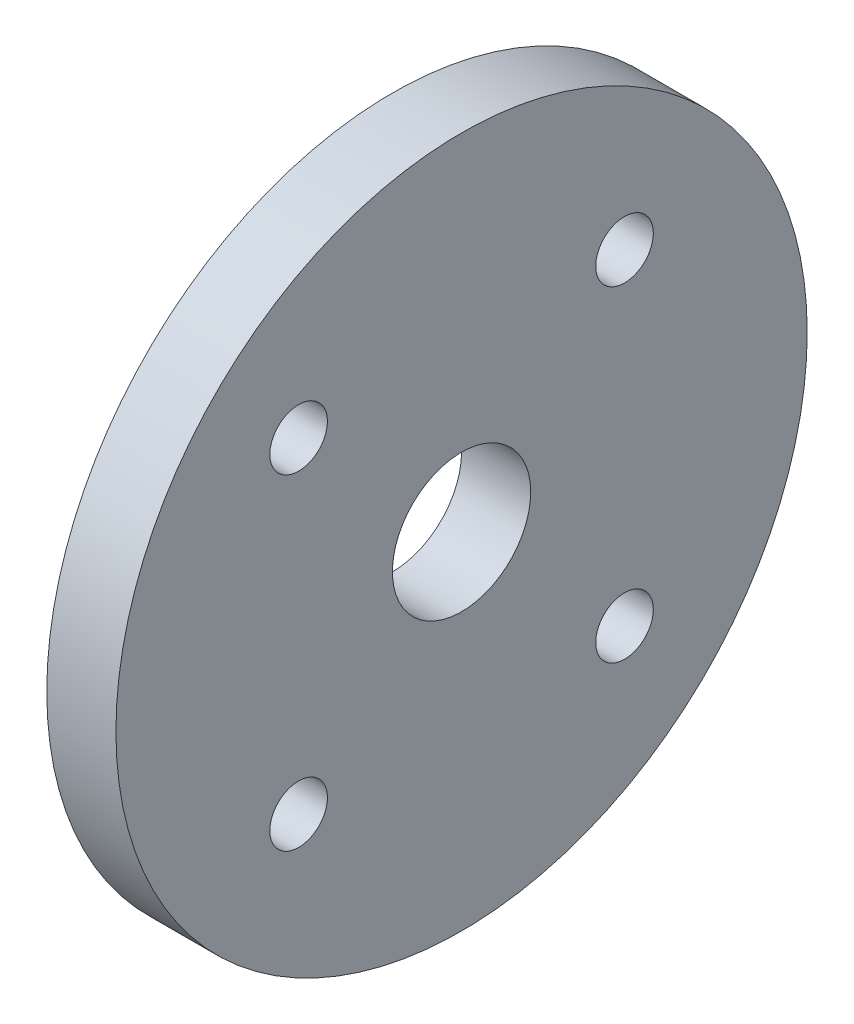
ISO-10303-21;
HEADER;
FILE_DESCRIPTION(('STEP AP214'),'2;1');
FILE_NAME('part.step','',(''),(''),'','','');
FILE_SCHEMA(('AUTOMOTIVE_DESIGN { 1 0 10303 214 1 1 1 1 }'));
ENDSEC;
DATA;
#1=APPLICATION_CONTEXT('core data for automotive mechanical design processes');
#2=APPLICATION_PROTOCOL_DEFINITION('international standard','automotive_design',2000,#1);
#3=PRODUCT_CONTEXT('',#1,'mechanical');
#4=PRODUCT('Part','Part','',(#3));
#5=PRODUCT_RELATED_PRODUCT_CATEGORY('part','',(#4));
#6=PRODUCT_DEFINITION_FORMATION('','',#4);
#7=PRODUCT_DEFINITION_CONTEXT('part definition',#1,'design');
#8=PRODUCT_DEFINITION('design','',#6,#7);
#9=PRODUCT_DEFINITION_SHAPE('','',#8);
#10=(LENGTH_UNIT() NAMED_UNIT(*) SI_UNIT(.MILLI.,.METRE.));
#11=(NAMED_UNIT(*) PLANE_ANGLE_UNIT() SI_UNIT($,.RADIAN.));
#12=(NAMED_UNIT(*) SI_UNIT($,.STERADIAN.) SOLID_ANGLE_UNIT());
#13=UNCERTAINTY_MEASURE_WITH_UNIT(LENGTH_MEASURE(1.E-05),#10,'distance_accuracy_value','');
#14=(GEOMETRIC_REPRESENTATION_CONTEXT(3) GLOBAL_UNCERTAINTY_ASSIGNED_CONTEXT((#13)) GLOBAL_UNIT_ASSIGNED_CONTEXT((#10,
#11,#12)) REPRESENTATION_CONTEXT('',''));
#15=CARTESIAN_POINT('',(0.,0.,0.));
#16=DIRECTION('',(0.,0.,1.));
#17=DIRECTION('',(1.,0.,0.));
#18=AXIS2_PLACEMENT_3D('',#15,#16,#17);
#19=CARTESIAN_POINT('',(3.,0.,0.));
#20=DIRECTION('',(-1.,0.,0.));
#21=DIRECTION('',(0.,0.,1.));
#22=AXIS2_PLACEMENT_3D('',#19,#20,#21);
#23=CYLINDRICAL_SURFACE('',#22,15.);
#24=CARTESIAN_POINT('',(3.,0.,0.));
#25=DIRECTION('',(1.,0.,0.));
#26=DIRECTION('',(0.,0.,-1.));
#27=AXIS2_PLACEMENT_3D('',#24,#25,#26);
#28=CIRCLE('',#27,15.);
#29=CARTESIAN_POINT('',(3.,0.,-15.));
#30=VERTEX_POINT('',#29);
#31=EDGE_CURVE('E10',#30,#30,#28,.T.);
#32=ORIENTED_EDGE('',*,*,#31,.F.);
#33=EDGE_LOOP('',(#32));
#34=FACE_BOUND('',#33,.T.);
#35=CARTESIAN_POINT('',(0.,0.,0.));
#36=DIRECTION('',(1.,0.,0.));
#37=DIRECTION('',(0.,0.,-1.));
#38=AXIS2_PLACEMENT_3D('',#35,#36,#37);
#39=CIRCLE('',#38,15.);
#40=CARTESIAN_POINT('',(0.,0.,-15.));
#41=VERTEX_POINT('',#40);
#42=EDGE_CURVE('E34',#41,#41,#39,.T.);
#43=ORIENTED_EDGE('',*,*,#42,.T.);
#44=EDGE_LOOP('',(#43));
#45=FACE_BOUND('',#44,.T.);
#46=ADVANCED_FACE('F31',(#34,#45),#23,.T.);
#47=CARTESIAN_POINT('',(3.,0.,0.));
#48=DIRECTION('',(1.,0.,0.));
#49=DIRECTION('',(0.,0.,-1.));
#50=AXIS2_PLACEMENT_3D('',#47,#48,#49);
#51=PLANE('',#50);
#52=CARTESIAN_POINT('',(3.,0.,0.));
#53=DIRECTION('',(1.,0.,0.));
#54=DIRECTION('',(0.,0.,-1.));
#55=AXIS2_PLACEMENT_3D('',#52,#53,#54);
#56=CIRCLE('',#55,3.);
#57=CARTESIAN_POINT('',(3.,0.,-3.));
#58=VERTEX_POINT('',#57);
#59=EDGE_CURVE('E67',#58,#58,#56,.T.);
#60=ORIENTED_EDGE('',*,*,#59,.F.);
#61=EDGE_LOOP('',(#60));
#62=FACE_BOUND('',#61,.T.);
#63=CARTESIAN_POINT('',(3.,7.07106781186547,7.07106781186548));
#64=DIRECTION('',(1.,0.,0.));
#65=DIRECTION('',(0.,0.,-1.));
#66=AXIS2_PLACEMENT_3D('',#63,#64,#65);
#67=CIRCLE('',#66,1.25);
#68=CARTESIAN_POINT('',(3.,7.07106781186547,5.82106781186548));
#69=VERTEX_POINT('',#68);
#70=EDGE_CURVE('E63',#69,#69,#67,.T.);
#71=ORIENTED_EDGE('',*,*,#70,.F.);
#72=EDGE_LOOP('',(#71));
#73=FACE_BOUND('',#72,.T.);
#74=CARTESIAN_POINT('',(3.,-7.07106781186548,-7.07106781186547));
#75=DIRECTION('',(1.,0.,0.));
#76=DIRECTION('',(0.,0.,-1.));
#77=AXIS2_PLACEMENT_3D('',#74,#75,#76);
#78=CIRCLE('',#77,1.25);
#79=CARTESIAN_POINT('',(3.,-7.07106781186548,-8.32106781186547));
#80=VERTEX_POINT('',#79);
#81=EDGE_CURVE('E57',#80,#80,#78,.T.);
#82=ORIENTED_EDGE('',*,*,#81,.F.);
#83=EDGE_LOOP('',(#82));
#84=FACE_BOUND('',#83,.T.);
#85=CARTESIAN_POINT('',(3.,7.07106781186547,-7.07106781186547));
#86=DIRECTION('',(1.,0.,0.));
#87=DIRECTION('',(0.,0.,-1.));
#88=AXIS2_PLACEMENT_3D('',#85,#86,#87);
#89=CIRCLE('',#88,1.25);
#90=CARTESIAN_POINT('',(3.,7.07106781186547,-8.32106781186547));
#91=VERTEX_POINT('',#90);
#92=EDGE_CURVE('E51',#91,#91,#89,.T.);
#93=ORIENTED_EDGE('',*,*,#92,.F.);
#94=EDGE_LOOP('',(#93));
#95=FACE_BOUND('',#94,.T.);
#96=CARTESIAN_POINT('',(3.,-7.07106781186548,7.07106781186547));
#97=DIRECTION('',(1.,0.,0.));
#98=DIRECTION('',(0.,0.,-1.));
#99=AXIS2_PLACEMENT_3D('',#96,#97,#98);
#100=CIRCLE('',#99,1.25);
#101=CARTESIAN_POINT('',(3.,-7.07106781186548,5.82106781186548));
#102=VERTEX_POINT('',#101);
#103=EDGE_CURVE('E45',#102,#102,#100,.T.);
#104=ORIENTED_EDGE('',*,*,#103,.F.);
#105=EDGE_LOOP('',(#104));
#106=FACE_BOUND('',#105,.T.);
#107=ORIENTED_EDGE('',*,*,#31,.T.);
#108=EDGE_LOOP('',(#107));
#109=FACE_BOUND('',#108,.T.);
#110=ADVANCED_FACE('F83',(#62,#73,#84,#95,#106,#109),#51,.T.);
#111=CARTESIAN_POINT('',(0.,0.,0.));
#112=DIRECTION('',(1.,0.,0.));
#113=DIRECTION('',(0.,0.,-1.));
#114=AXIS2_PLACEMENT_3D('',#111,#112,#113);
#115=PLANE('',#114);
#116=CARTESIAN_POINT('',(0.,0.,0.));
#117=DIRECTION('',(1.,0.,0.));
#118=DIRECTION('',(0.,0.,-1.));
#119=AXIS2_PLACEMENT_3D('',#116,#117,#118);
#120=CIRCLE('',#119,3.);
#121=CARTESIAN_POINT('',(0.,0.,-3.));
#122=VERTEX_POINT('',#121);
#123=EDGE_CURVE('E66',#122,#122,#120,.T.);
#124=ORIENTED_EDGE('',*,*,#123,.T.);
#125=EDGE_LOOP('',(#124));
#126=FACE_BOUND('',#125,.T.);
#127=CARTESIAN_POINT('',(0.,7.07106781186547,7.07106781186548));
#128=DIRECTION('',(1.,0.,0.));
#129=DIRECTION('',(0.,0.,-1.));
#130=AXIS2_PLACEMENT_3D('',#127,#128,#129);
#131=CIRCLE('',#130,1.25);
#132=CARTESIAN_POINT('',(0.,7.07106781186547,5.82106781186548));
#133=VERTEX_POINT('',#132);
#134=EDGE_CURVE('E60',#133,#133,#131,.T.);
#135=ORIENTED_EDGE('',*,*,#134,.T.);
#136=EDGE_LOOP('',(#135));
#137=FACE_BOUND('',#136,.T.);
#138=CARTESIAN_POINT('',(0.,-7.07106781186548,-7.07106781186547));
#139=DIRECTION('',(1.,0.,0.));
#140=DIRECTION('',(0.,0.,-1.));
#141=AXIS2_PLACEMENT_3D('',#138,#139,#140);
#142=CIRCLE('',#141,1.25);
#143=CARTESIAN_POINT('',(0.,-7.07106781186548,-8.32106781186547));
#144=VERTEX_POINT('',#143);
#145=EDGE_CURVE('E54',#144,#144,#142,.T.);
#146=ORIENTED_EDGE('',*,*,#145,.T.);
#147=EDGE_LOOP('',(#146));
#148=FACE_BOUND('',#147,.T.);
#149=CARTESIAN_POINT('',(0.,7.07106781186547,-7.07106781186547));
#150=DIRECTION('',(1.,0.,0.));
#151=DIRECTION('',(0.,0.,-1.));
#152=AXIS2_PLACEMENT_3D('',#149,#150,#151);
#153=CIRCLE('',#152,1.25);
#154=CARTESIAN_POINT('',(0.,7.07106781186547,-8.32106781186547));
#155=VERTEX_POINT('',#154);
#156=EDGE_CURVE('E48',#155,#155,#153,.T.);
#157=ORIENTED_EDGE('',*,*,#156,.T.);
#158=EDGE_LOOP('',(#157));
#159=FACE_BOUND('',#158,.T.);
#160=CARTESIAN_POINT('',(0.,-7.07106781186548,7.07106781186547));
#161=DIRECTION('',(1.,0.,0.));
#162=DIRECTION('',(0.,0.,-1.));
#163=AXIS2_PLACEMENT_3D('',#160,#161,#162);
#164=CIRCLE('',#163,1.25);
#165=CARTESIAN_POINT('',(0.,-7.07106781186548,5.82106781186548));
#166=VERTEX_POINT('',#165);
#167=EDGE_CURVE('E41',#166,#166,#164,.T.);
#168=ORIENTED_EDGE('',*,*,#167,.T.);
#169=EDGE_LOOP('',(#168));
#170=FACE_BOUND('',#169,.T.);
#171=ORIENTED_EDGE('',*,*,#42,.F.);
#172=EDGE_LOOP('',(#171));
#173=FACE_BOUND('',#172,.T.);
#174=ADVANCED_FACE('F73',(#126,#137,#148,#159,#170,#173),#115,.F.);
#175=CARTESIAN_POINT('',(3.,-7.07106781186548,7.07106781186547));
#176=DIRECTION('',(1.,0.,0.));
#177=DIRECTION('',(0.,0.,-1.));
#178=AXIS2_PLACEMENT_3D('',#175,#176,#177);
#179=CYLINDRICAL_SURFACE('',#178,1.25);
#180=ORIENTED_EDGE('',*,*,#167,.F.);
#181=EDGE_LOOP('',(#180));
#182=FACE_BOUND('',#181,.T.);
#183=ORIENTED_EDGE('',*,*,#103,.T.);
#184=EDGE_LOOP('',(#183));
#185=FACE_BOUND('',#184,.T.);
#186=ADVANCED_FACE('F95',(#182,#185),#179,.F.);
#187=CARTESIAN_POINT('',(3.,7.07106781186547,-7.07106781186547));
#188=DIRECTION('',(1.,0.,0.));
#189=DIRECTION('',(0.,0.,-1.));
#190=AXIS2_PLACEMENT_3D('',#187,#188,#189);
#191=CYLINDRICAL_SURFACE('',#190,1.25);
#192=ORIENTED_EDGE('',*,*,#156,.F.);
#193=EDGE_LOOP('',(#192));
#194=FACE_BOUND('',#193,.T.);
#195=ORIENTED_EDGE('',*,*,#92,.T.);
#196=EDGE_LOOP('',(#195));
#197=FACE_BOUND('',#196,.T.);
#198=ADVANCED_FACE('F97',(#194,#197),#191,.F.);
#199=CARTESIAN_POINT('',(3.,-7.07106781186548,-7.07106781186547));
#200=DIRECTION('',(1.,0.,0.));
#201=DIRECTION('',(0.,0.,-1.));
#202=AXIS2_PLACEMENT_3D('',#199,#200,#201);
#203=CYLINDRICAL_SURFACE('',#202,1.25);
#204=ORIENTED_EDGE('',*,*,#145,.F.);
#205=EDGE_LOOP('',(#204));
#206=FACE_BOUND('',#205,.T.);
#207=ORIENTED_EDGE('',*,*,#81,.T.);
#208=EDGE_LOOP('',(#207));
#209=FACE_BOUND('',#208,.T.);
#210=ADVANCED_FACE('F104',(#206,#209),#203,.F.);
#211=CARTESIAN_POINT('',(3.,7.07106781186547,7.07106781186548));
#212=DIRECTION('',(1.,0.,0.));
#213=DIRECTION('',(0.,0.,-1.));
#214=AXIS2_PLACEMENT_3D('',#211,#212,#213);
#215=CYLINDRICAL_SURFACE('',#214,1.25);
#216=ORIENTED_EDGE('',*,*,#134,.F.);
#217=EDGE_LOOP('',(#216));
#218=FACE_BOUND('',#217,.T.);
#219=ORIENTED_EDGE('',*,*,#70,.T.);
#220=EDGE_LOOP('',(#219));
#221=FACE_BOUND('',#220,.T.);
#222=ADVANCED_FACE('F79',(#218,#221),#215,.F.);
#223=CARTESIAN_POINT('',(0.,0.,0.));
#224=DIRECTION('',(1.,0.,0.));
#225=DIRECTION('',(0.,0.,-1.));
#226=AXIS2_PLACEMENT_3D('',#223,#224,#225);
#227=CYLINDRICAL_SURFACE('',#226,3.);
#228=ORIENTED_EDGE('',*,*,#123,.F.);
#229=EDGE_LOOP('',(#228));
#230=FACE_BOUND('',#229,.T.);
#231=ORIENTED_EDGE('',*,*,#59,.T.);
#232=EDGE_LOOP('',(#231));
#233=FACE_BOUND('',#232,.T.);
#234=ADVANCED_FACE('F76',(#230,#233),#227,.F.);
#235=CLOSED_SHELL('',(#46,#110,#174,#186,#198,#210,#222,#234));
#236=MANIFOLD_SOLID_BREP('B2',#235);
#237=ADVANCED_BREP_SHAPE_REPRESENTATION('',(#18,#236),#14);
#238=SHAPE_DEFINITION_REPRESENTATION(#9,#237);
ENDSEC;
END-ISO-10303-21;
